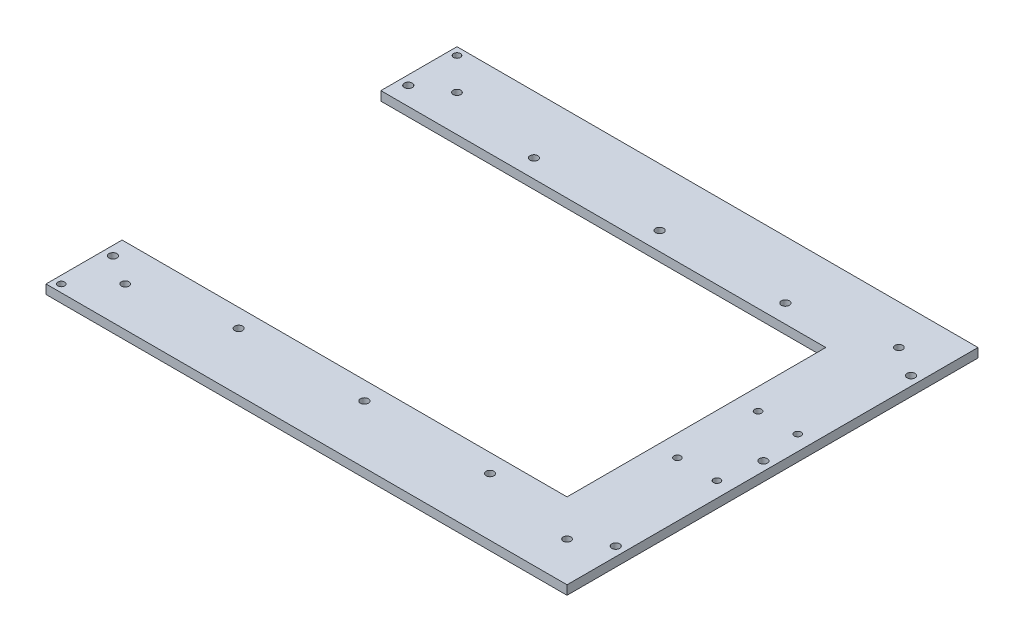
ISO-10303-21;
HEADER;
FILE_DESCRIPTION(('STEP AP214'),'2;1');
FILE_NAME('part.step','',(''),(''),'','','');
FILE_SCHEMA(('AUTOMOTIVE_DESIGN { 1 0 10303 214 1 1 1 1 }'));
ENDSEC;
DATA;
#1=APPLICATION_CONTEXT('core data for automotive mechanical design processes');
#2=APPLICATION_PROTOCOL_DEFINITION('international standard','automotive_design',2000,#1);
#3=PRODUCT_CONTEXT('',#1,'mechanical');
#4=PRODUCT('Part','Part','',(#3));
#5=PRODUCT_RELATED_PRODUCT_CATEGORY('part','',(#4));
#6=PRODUCT_DEFINITION_FORMATION('','',#4);
#7=PRODUCT_DEFINITION_CONTEXT('part definition',#1,'design');
#8=PRODUCT_DEFINITION('design','',#6,#7);
#9=PRODUCT_DEFINITION_SHAPE('','',#8);
#10=(LENGTH_UNIT() NAMED_UNIT(*) SI_UNIT(.MILLI.,.METRE.));
#11=(NAMED_UNIT(*) PLANE_ANGLE_UNIT() SI_UNIT($,.RADIAN.));
#12=(NAMED_UNIT(*) SI_UNIT($,.STERADIAN.) SOLID_ANGLE_UNIT());
#13=UNCERTAINTY_MEASURE_WITH_UNIT(LENGTH_MEASURE(1.E-05),#10,'distance_accuracy_value','');
#14=(GEOMETRIC_REPRESENTATION_CONTEXT(3) GLOBAL_UNCERTAINTY_ASSIGNED_CONTEXT((#13)) GLOBAL_UNIT_ASSIGNED_CONTEXT((#10,
#11,#12)) REPRESENTATION_CONTEXT('',''));
#15=CARTESIAN_POINT('',(0.,0.,0.));
#16=DIRECTION('',(0.,0.,1.));
#17=DIRECTION('',(1.,0.,0.));
#18=AXIS2_PLACEMENT_3D('',#15,#16,#17);
#19=CARTESIAN_POINT('',(0.,0.,0.));
#20=DIRECTION('',(0.,-1.,0.));
#21=DIRECTION('',(0.,0.,-1.));
#22=AXIS2_PLACEMENT_3D('',#19,#20,#21);
#23=PLANE('',#22);
#24=CARTESIAN_POINT('',(-286.3,0.,115.921508101416));
#25=DIRECTION('',(0.,1.,0.));
#26=DIRECTION('',(0.,0.,1.));
#27=AXIS2_PLACEMENT_3D('',#24,#25,#26);
#28=CIRCLE('',#27,2.59999999999999);
#29=CARTESIAN_POINT('',(-286.3,0.,118.521508101416));
#30=VERTEX_POINT('',#29);
#31=EDGE_CURVE('E597',#30,#30,#28,.T.);
#32=ORIENTED_EDGE('',*,*,#31,.T.);
#33=EDGE_LOOP('',(#32));
#34=FACE_BOUND('',#33,.T.);
#35=CARTESIAN_POINT('',(-203.725,0.,115.921508101416));
#36=DIRECTION('',(0.,1.,0.));
#37=DIRECTION('',(0.,0.,1.));
#38=AXIS2_PLACEMENT_3D('',#35,#36,#37);
#39=CIRCLE('',#38,2.59999999999999);
#40=CARTESIAN_POINT('',(-203.725,0.,118.521508101416));
#41=VERTEX_POINT('',#40);
#42=EDGE_CURVE('E607',#41,#41,#39,.T.);
#43=ORIENTED_EDGE('',*,*,#42,.T.);
#44=EDGE_LOOP('',(#43));
#45=FACE_BOUND('',#44,.T.);
#46=CARTESIAN_POINT('',(-121.15,0.,115.921508101416));
#47=DIRECTION('',(0.,1.,0.));
#48=DIRECTION('',(0.,0.,1.));
#49=AXIS2_PLACEMENT_3D('',#46,#47,#48);
#50=CIRCLE('',#49,2.6);
#51=CARTESIAN_POINT('',(-121.15,0.,118.521508101416));
#52=VERTEX_POINT('',#51);
#53=EDGE_CURVE('E613',#52,#52,#50,.T.);
#54=ORIENTED_EDGE('',*,*,#53,.T.);
#55=EDGE_LOOP('',(#54));
#56=FACE_BOUND('',#55,.T.);
#57=CARTESIAN_POINT('',(-38.575,0.,115.921508101416));
#58=DIRECTION('',(0.,1.,0.));
#59=DIRECTION('',(0.,0.,1.));
#60=AXIS2_PLACEMENT_3D('',#57,#58,#59);
#61=CIRCLE('',#60,2.6);
#62=CARTESIAN_POINT('',(-38.575,0.,118.521508101416));
#63=VERTEX_POINT('',#62);
#64=EDGE_CURVE('E619',#63,#63,#61,.T.);
#65=ORIENTED_EDGE('',*,*,#64,.T.);
#66=EDGE_LOOP('',(#65));
#67=FACE_BOUND('',#66,.T.);
#68=CARTESIAN_POINT('',(44.0000000000001,0.,115.921508101416));
#69=DIRECTION('',(0.,1.,0.));
#70=DIRECTION('',(0.,0.,1.));
#71=AXIS2_PLACEMENT_3D('',#68,#69,#70);
#72=CIRCLE('',#71,2.6);
#73=CARTESIAN_POINT('',(44.0000000000001,0.,118.521508101416));
#74=VERTEX_POINT('',#73);
#75=EDGE_CURVE('E625',#74,#74,#72,.T.);
#76=ORIENTED_EDGE('',*,*,#75,.T.);
#77=EDGE_LOOP('',(#76));
#78=FACE_BOUND('',#77,.T.);
#79=CARTESIAN_POINT('',(43.9999999999999,0.,309.921508101416));
#80=DIRECTION('',(0.,1.,0.));
#81=DIRECTION('',(0.,0.,1.));
#82=AXIS2_PLACEMENT_3D('',#79,#80,#81);
#83=CIRCLE('',#82,2.6);
#84=CARTESIAN_POINT('',(43.9999999999999,0.,312.521508101416));
#85=VERTEX_POINT('',#84);
#86=EDGE_CURVE('E631',#85,#85,#83,.T.);
#87=ORIENTED_EDGE('',*,*,#86,.T.);
#88=EDGE_LOOP('',(#87));
#89=FACE_BOUND('',#88,.T.);
#90=CARTESIAN_POINT('',(-38.5750000000001,0.,309.921508101416));
#91=DIRECTION('',(0.,1.,0.));
#92=DIRECTION('',(0.,0.,1.));
#93=AXIS2_PLACEMENT_3D('',#90,#91,#92);
#94=CIRCLE('',#93,2.6);
#95=CARTESIAN_POINT('',(-38.5750000000001,0.,312.521508101416));
#96=VERTEX_POINT('',#95);
#97=EDGE_CURVE('E637',#96,#96,#94,.T.);
#98=ORIENTED_EDGE('',*,*,#97,.T.);
#99=EDGE_LOOP('',(#98));
#100=FACE_BOUND('',#99,.T.);
#101=CARTESIAN_POINT('',(-121.15,0.,309.921508101416));
#102=DIRECTION('',(0.,1.,0.));
#103=DIRECTION('',(0.,0.,1.));
#104=AXIS2_PLACEMENT_3D('',#101,#102,#103);
#105=CIRCLE('',#104,2.6);
#106=CARTESIAN_POINT('',(-121.15,0.,312.521508101416));
#107=VERTEX_POINT('',#106);
#108=EDGE_CURVE('E643',#107,#107,#105,.T.);
#109=ORIENTED_EDGE('',*,*,#108,.T.);
#110=EDGE_LOOP('',(#109));
#111=FACE_BOUND('',#110,.T.);
#112=CARTESIAN_POINT('',(-203.725,0.,309.921508101416));
#113=DIRECTION('',(0.,1.,0.));
#114=DIRECTION('',(0.,0.,1.));
#115=AXIS2_PLACEMENT_3D('',#112,#113,#114);
#116=CIRCLE('',#115,2.59999999999999);
#117=CARTESIAN_POINT('',(-203.725,0.,312.521508101416));
#118=VERTEX_POINT('',#117);
#119=EDGE_CURVE('E649',#118,#118,#116,.T.);
#120=ORIENTED_EDGE('',*,*,#119,.T.);
#121=EDGE_LOOP('',(#120));
#122=FACE_BOUND('',#121,.T.);
#123=CARTESIAN_POINT('',(-286.3,0.,309.921508101416));
#124=DIRECTION('',(0.,1.,0.));
#125=DIRECTION('',(0.,0.,1.));
#126=AXIS2_PLACEMENT_3D('',#123,#124,#125);
#127=CIRCLE('',#126,2.59999999999999);
#128=CARTESIAN_POINT('',(-286.3,0.,312.521508101416));
#129=VERTEX_POINT('',#128);
#130=EDGE_CURVE('E655',#129,#129,#127,.T.);
#131=ORIENTED_EDGE('',*,*,#130,.T.);
#132=EDGE_LOOP('',(#131));
#133=FACE_BOUND('',#132,.T.);
#134=CARTESIAN_POINT('',(43.9999999999999,0.,212.921508101416));
#135=DIRECTION('',(0.,1.,0.));
#136=DIRECTION('',(0.,0.,1.));
#137=AXIS2_PLACEMENT_3D('',#134,#135,#136);
#138=CIRCLE('',#137,2.6);
#139=CARTESIAN_POINT('',(43.9999999999999,0.,215.521508101416));
#140=VERTEX_POINT('',#139);
#141=EDGE_CURVE('E210',#140,#140,#138,.T.);
#142=ORIENTED_EDGE('',*,*,#141,.T.);
#143=EDGE_LOOP('',(#142));
#144=FACE_BOUND('',#143,.T.);
#145=DIRECTION('',(0.,0.,1.));
#146=VECTOR('',#145,1.);
#147=CARTESIAN_POINT('',(-292.3,0.,77.9215081014159));
#148=LINE('',#147,#146);
#149=CARTESIAN_POINT('',(-292.3,0.,77.9215081014159));
#150=VERTEX_POINT('',#149);
#151=CARTESIAN_POINT('',(-292.3,0.,127.921508101416));
#152=VERTEX_POINT('',#151);
#153=EDGE_CURVE('E62',#150,#152,#148,.T.);
#154=ORIENTED_EDGE('',*,*,#153,.F.);
#155=DIRECTION('',(-1.,0.,0.));
#156=VECTOR('',#155,1.);
#157=CARTESIAN_POINT('',(-292.3,0.,77.9215081014159));
#158=LINE('',#157,#156);
#159=CARTESIAN_POINT('',(49.9999999999999,0.,77.9215081014159));
#160=VERTEX_POINT('',#159);
#161=EDGE_CURVE('E162',#160,#150,#158,.T.);
#162=ORIENTED_EDGE('',*,*,#161,.F.);
#163=DIRECTION('',(0.,0.,-1.));
#164=VECTOR('',#163,1.);
#165=CARTESIAN_POINT('',(49.9999999999999,0.,77.9215081014159));
#166=LINE('',#165,#164);
#167=CARTESIAN_POINT('',(49.9999999999999,0.,347.921508101416));
#168=VERTEX_POINT('',#167);
#169=EDGE_CURVE('E236',#168,#160,#166,.T.);
#170=ORIENTED_EDGE('',*,*,#169,.F.);
#171=DIRECTION('',(1.,0.,0.));
#172=VECTOR('',#171,1.);
#173=CARTESIAN_POINT('',(-292.3,0.,347.921508101416));
#174=LINE('',#173,#172);
#175=CARTESIAN_POINT('',(-292.3,0.,347.921508101416));
#176=VERTEX_POINT('',#175);
#177=EDGE_CURVE('E140',#176,#168,#174,.T.);
#178=ORIENTED_EDGE('',*,*,#177,.F.);
#179=DIRECTION('',(0.,0.,1.));
#180=VECTOR('',#179,1.);
#181=CARTESIAN_POINT('',(-292.3,0.,297.921508101416));
#182=LINE('',#181,#180);
#183=CARTESIAN_POINT('',(-292.3,0.,297.921508101416));
#184=VERTEX_POINT('',#183);
#185=EDGE_CURVE('E138',#184,#176,#182,.T.);
#186=ORIENTED_EDGE('',*,*,#185,.F.);
#187=DIRECTION('',(-1.,0.,0.));
#188=VECTOR('',#187,1.);
#189=CARTESIAN_POINT('',(-292.3,0.,297.921508101416));
#190=LINE('',#189,#188);
#191=CARTESIAN_POINT('',(-2.22044604925031E-13,0.,297.921508101416));
#192=VERTEX_POINT('',#191);
#193=EDGE_CURVE('E126',#192,#184,#190,.T.);
#194=ORIENTED_EDGE('',*,*,#193,.F.);
#195=DIRECTION('',(0.,0.,1.));
#196=VECTOR('',#195,1.);
#197=CARTESIAN_POINT('',(-2.22044604925031E-13,0.,127.921508101416));
#198=LINE('',#197,#196);
#199=CARTESIAN_POINT('',(-2.22044604925031E-13,0.,127.921508101416));
#200=VERTEX_POINT('',#199);
#201=EDGE_CURVE('E117',#200,#192,#198,.T.);
#202=ORIENTED_EDGE('',*,*,#201,.F.);
#203=DIRECTION('',(1.,0.,0.));
#204=VECTOR('',#203,1.);
#205=CARTESIAN_POINT('',(-292.3,0.,127.921508101416));
#206=LINE('',#205,#204);
#207=EDGE_CURVE('E125',#152,#200,#206,.T.);
#208=ORIENTED_EDGE('',*,*,#207,.F.);
#209=EDGE_LOOP('',(#154,#162,#170,#178,#186,#194,#202,#208));
#210=FACE_BOUND('',#209,.T.);
#211=CARTESIAN_POINT('',(39.9999999999999,0.,186.421508101416));
#212=DIRECTION('',(0.,-1.,0.));
#213=DIRECTION('',(0.,0.,-1.));
#214=AXIS2_PLACEMENT_3D('',#211,#212,#213);
#215=CIRCLE('',#214,2.25);
#216=CARTESIAN_POINT('',(39.9999999999999,0.,184.171508101416));
#217=VERTEX_POINT('',#216);
#218=EDGE_CURVE('E212',#217,#217,#215,.F.);
#219=ORIENTED_EDGE('',*,*,#218,.T.);
#220=EDGE_LOOP('',(#219));
#221=FACE_BOUND('',#220,.T.);
#222=CARTESIAN_POINT('',(13.9999999999999,0.,239.421508101416));
#223=DIRECTION('',(0.,-1.,0.));
#224=DIRECTION('',(0.,0.,-1.));
#225=AXIS2_PLACEMENT_3D('',#222,#223,#224);
#226=CIRCLE('',#225,2.25);
#227=CARTESIAN_POINT('',(13.9999999999999,0.,237.171508101416));
#228=VERTEX_POINT('',#227);
#229=EDGE_CURVE('E206',#228,#228,#226,.F.);
#230=ORIENTED_EDGE('',*,*,#229,.T.);
#231=EDGE_LOOP('',(#230));
#232=FACE_BOUND('',#231,.T.);
#233=CARTESIAN_POINT('',(13.9999999999999,0.,186.421508101416));
#234=DIRECTION('',(0.,-1.,0.));
#235=DIRECTION('',(0.,0.,-1.));
#236=AXIS2_PLACEMENT_3D('',#233,#234,#235);
#237=CIRCLE('',#236,2.25);
#238=CARTESIAN_POINT('',(13.9999999999999,0.,184.171508101416));
#239=VERTEX_POINT('',#238);
#240=EDGE_CURVE('E209',#239,#239,#237,.F.);
#241=ORIENTED_EDGE('',*,*,#240,.T.);
#242=EDGE_LOOP('',(#241));
#243=FACE_BOUND('',#242,.T.);
#244=CARTESIAN_POINT('',(39.9999999999999,0.,239.421508101416));
#245=DIRECTION('',(0.,-1.,0.));
#246=DIRECTION('',(0.,0.,-1.));
#247=AXIS2_PLACEMENT_3D('',#244,#245,#246);
#248=CIRCLE('',#247,2.25);
#249=CARTESIAN_POINT('',(39.9999999999999,0.,237.171508101416));
#250=VERTEX_POINT('',#249);
#251=EDGE_CURVE('E47',#250,#250,#248,.F.);
#252=ORIENTED_EDGE('',*,*,#251,.T.);
#253=EDGE_LOOP('',(#252));
#254=FACE_BOUND('',#253,.T.);
#255=CARTESIAN_POINT('',(-287.3,0.,342.921508101416));
#256=DIRECTION('',(0.,-1.,0.));
#257=DIRECTION('',(0.,0.,-1.));
#258=AXIS2_PLACEMENT_3D('',#255,#256,#257);
#259=CIRCLE('',#258,2.24999999999996);
#260=CARTESIAN_POINT('',(-287.3,0.,340.671508101416));
#261=VERTEX_POINT('',#260);
#262=EDGE_CURVE('E201',#261,#261,#259,.T.);
#263=ORIENTED_EDGE('',*,*,#262,.F.);
#264=EDGE_LOOP('',(#263));
#265=FACE_BOUND('',#264,.T.);
#266=CARTESIAN_POINT('',(-266.3,0.,321.921508101416));
#267=DIRECTION('',(0.,1.,0.));
#268=DIRECTION('',(0.,0.,1.));
#269=AXIS2_PLACEMENT_3D('',#266,#267,#268);
#270=CIRCLE('',#269,2.49999999999991);
#271=CARTESIAN_POINT('',(-266.3,0.,324.421508101416));
#272=VERTEX_POINT('',#271);
#273=EDGE_CURVE('E168',#272,#272,#270,.T.);
#274=ORIENTED_EDGE('',*,*,#273,.T.);
#275=EDGE_LOOP('',(#274));
#276=FACE_BOUND('',#275,.T.);
#277=CARTESIAN_POINT('',(23.9999999999999,0.,321.921508101416));
#278=DIRECTION('',(0.,1.,0.));
#279=DIRECTION('',(0.,0.,1.));
#280=AXIS2_PLACEMENT_3D('',#277,#278,#279);
#281=CIRCLE('',#280,2.49999999999991);
#282=CARTESIAN_POINT('',(23.9999999999999,0.,324.421508101416));
#283=VERTEX_POINT('',#282);
#284=EDGE_CURVE('E174',#283,#283,#281,.T.);
#285=ORIENTED_EDGE('',*,*,#284,.T.);
#286=EDGE_LOOP('',(#285));
#287=FACE_BOUND('',#286,.T.);
#288=CARTESIAN_POINT('',(-287.3,0.,82.9215081014159));
#289=DIRECTION('',(0.,-1.,0.));
#290=DIRECTION('',(0.,0.,-1.));
#291=AXIS2_PLACEMENT_3D('',#288,#289,#290);
#292=CIRCLE('',#291,2.25000000000001);
#293=CARTESIAN_POINT('',(-287.3,0.,80.6715081014158));
#294=VERTEX_POINT('',#293);
#295=EDGE_CURVE('E53',#294,#294,#292,.T.);
#296=ORIENTED_EDGE('',*,*,#295,.F.);
#297=EDGE_LOOP('',(#296));
#298=FACE_BOUND('',#297,.T.);
#299=CARTESIAN_POINT('',(23.9999999999999,0.,103.921508101416));
#300=DIRECTION('',(0.,1.,0.));
#301=DIRECTION('',(0.,0.,1.));
#302=AXIS2_PLACEMENT_3D('',#299,#300,#301);
#303=CIRCLE('',#302,2.49999999999991);
#304=CARTESIAN_POINT('',(23.9999999999999,0.,106.421508101416));
#305=VERTEX_POINT('',#304);
#306=EDGE_CURVE('E171',#305,#305,#303,.T.);
#307=ORIENTED_EDGE('',*,*,#306,.T.);
#308=EDGE_LOOP('',(#307));
#309=FACE_BOUND('',#308,.T.);
#310=CARTESIAN_POINT('',(-266.3,0.,103.921508101416));
#311=DIRECTION('',(0.,1.,0.));
#312=DIRECTION('',(0.,0.,1.));
#313=AXIS2_PLACEMENT_3D('',#310,#311,#312);
#314=CIRCLE('',#313,2.49999999999991);
#315=CARTESIAN_POINT('',(-266.3,0.,106.421508101416));
#316=VERTEX_POINT('',#315);
#317=EDGE_CURVE('E146',#316,#316,#314,.T.);
#318=ORIENTED_EDGE('',*,*,#317,.T.);
#319=EDGE_LOOP('',(#318));
#320=FACE_BOUND('',#319,.T.);
#321=ADVANCED_FACE('F43',(#34,#45,#56,#67,#78,#89,#100,#111,#122,#133,#144,#210,#221,#232,#243,
#254,#265,#276,#287,#298,#309,#320),#23,.T.);
#322=CARTESIAN_POINT('',(-292.3,6.,127.921508101416));
#323=DIRECTION('',(0.,0.,-1.));
#324=DIRECTION('',(-1.,0.,0.));
#325=AXIS2_PLACEMENT_3D('',#322,#323,#324);
#326=PLANE('',#325);
#327=ORIENTED_EDGE('',*,*,#207,.T.);
#328=DIRECTION('',(0.,-1.,0.));
#329=VECTOR('',#328,1.);
#330=CARTESIAN_POINT('',(-2.22044604925031E-13,6.,127.921508101416));
#331=LINE('',#330,#329);
#332=CARTESIAN_POINT('',(-2.22044604925031E-13,6.,127.921508101416));
#333=VERTEX_POINT('',#332);
#334=EDGE_CURVE('E123',#333,#200,#331,.T.);
#335=ORIENTED_EDGE('',*,*,#334,.F.);
#336=DIRECTION('',(1.,0.,0.));
#337=VECTOR('',#336,1.);
#338=CARTESIAN_POINT('',(-292.3,6.,127.921508101416));
#339=LINE('',#338,#337);
#340=CARTESIAN_POINT('',(-292.3,6.,127.921508101416));
#341=VERTEX_POINT('',#340);
#342=EDGE_CURVE('E91',#341,#333,#339,.T.);
#343=ORIENTED_EDGE('',*,*,#342,.F.);
#344=DIRECTION('',(0.,-1.,0.));
#345=VECTOR('',#344,1.);
#346=CARTESIAN_POINT('',(-292.3,6.,127.921508101416));
#347=LINE('',#346,#345);
#348=EDGE_CURVE('E216',#341,#152,#347,.T.);
#349=ORIENTED_EDGE('',*,*,#348,.T.);
#350=EDGE_LOOP('',(#327,#335,#343,#349));
#351=FACE_BOUND('',#350,.T.);
#352=ADVANCED_FACE('F261',(#351),#326,.F.);
#353=CARTESIAN_POINT('',(-2.22044604925031E-13,6.,127.921508101416));
#354=DIRECTION('',(1.,0.,0.));
#355=DIRECTION('',(0.,0.,-1.));
#356=AXIS2_PLACEMENT_3D('',#353,#354,#355);
#357=PLANE('',#356);
#358=ORIENTED_EDGE('',*,*,#201,.T.);
#359=DIRECTION('',(0.,-1.,0.));
#360=VECTOR('',#359,1.);
#361=CARTESIAN_POINT('',(-2.22044604925031E-13,6.,297.921508101416));
#362=LINE('',#361,#360);
#363=CARTESIAN_POINT('',(-2.22044604925031E-13,6.,297.921508101416));
#364=VERTEX_POINT('',#363);
#365=EDGE_CURVE('E121',#364,#192,#362,.T.);
#366=ORIENTED_EDGE('',*,*,#365,.F.);
#367=DIRECTION('',(0.,0.,1.));
#368=VECTOR('',#367,1.);
#369=CARTESIAN_POINT('',(-2.22044604925031E-13,6.,127.921508101416));
#370=LINE('',#369,#368);
#371=EDGE_CURVE('E157',#333,#364,#370,.T.);
#372=ORIENTED_EDGE('',*,*,#371,.F.);
#373=ORIENTED_EDGE('',*,*,#334,.T.);
#374=EDGE_LOOP('',(#358,#366,#372,#373));
#375=FACE_BOUND('',#374,.T.);
#376=ADVANCED_FACE('F119',(#375),#357,.F.);
#377=CARTESIAN_POINT('',(-292.3,6.,297.921508101416));
#378=DIRECTION('',(0.,0.,1.));
#379=DIRECTION('',(1.,0.,0.));
#380=AXIS2_PLACEMENT_3D('',#377,#378,#379);
#381=PLANE('',#380);
#382=ORIENTED_EDGE('',*,*,#193,.T.);
#383=DIRECTION('',(0.,-1.,0.));
#384=VECTOR('',#383,1.);
#385=CARTESIAN_POINT('',(-292.3,6.,297.921508101416));
#386=LINE('',#385,#384);
#387=CARTESIAN_POINT('',(-292.3,6.,297.921508101416));
#388=VERTEX_POINT('',#387);
#389=EDGE_CURVE('E134',#388,#184,#386,.T.);
#390=ORIENTED_EDGE('',*,*,#389,.F.);
#391=DIRECTION('',(-1.,0.,0.));
#392=VECTOR('',#391,1.);
#393=CARTESIAN_POINT('',(-292.3,6.,297.921508101416));
#394=LINE('',#393,#392);
#395=EDGE_CURVE('E133',#364,#388,#394,.T.);
#396=ORIENTED_EDGE('',*,*,#395,.F.);
#397=ORIENTED_EDGE('',*,*,#365,.T.);
#398=EDGE_LOOP('',(#382,#390,#396,#397));
#399=FACE_BOUND('',#398,.T.);
#400=ADVANCED_FACE('F130',(#399),#381,.F.);
#401=CARTESIAN_POINT('',(-292.3,6.,297.921508101416));
#402=DIRECTION('',(1.,0.,0.));
#403=DIRECTION('',(0.,0.,-1.));
#404=AXIS2_PLACEMENT_3D('',#401,#402,#403);
#405=PLANE('',#404);
#406=ORIENTED_EDGE('',*,*,#389,.T.);
#407=ORIENTED_EDGE('',*,*,#185,.T.);
#408=DIRECTION('',(0.,-1.,0.));
#409=VECTOR('',#408,1.);
#410=CARTESIAN_POINT('',(-292.3,6.,347.921508101416));
#411=LINE('',#410,#409);
#412=CARTESIAN_POINT('',(-292.3,6.,347.921508101416));
#413=VERTEX_POINT('',#412);
#414=EDGE_CURVE('E225',#413,#176,#411,.T.);
#415=ORIENTED_EDGE('',*,*,#414,.F.);
#416=DIRECTION('',(0.,0.,1.));
#417=VECTOR('',#416,1.);
#418=CARTESIAN_POINT('',(-292.3,6.,297.921508101416));
#419=LINE('',#418,#417);
#420=EDGE_CURVE('E154',#388,#413,#419,.T.);
#421=ORIENTED_EDGE('',*,*,#420,.F.);
#422=EDGE_LOOP('',(#406,#407,#415,#421));
#423=FACE_BOUND('',#422,.T.);
#424=ADVANCED_FACE('F251',(#423),#405,.F.);
#425=CARTESIAN_POINT('',(-292.3,6.,347.921508101416));
#426=DIRECTION('',(0.,0.,-1.));
#427=DIRECTION('',(-1.,0.,0.));
#428=AXIS2_PLACEMENT_3D('',#425,#426,#427);
#429=PLANE('',#428);
#430=ORIENTED_EDGE('',*,*,#177,.T.);
#431=DIRECTION('',(0.,-1.,0.));
#432=VECTOR('',#431,1.);
#433=CARTESIAN_POINT('',(49.9999999999999,6.,347.921508101416));
#434=LINE('',#433,#432);
#435=CARTESIAN_POINT('',(49.9999999999999,6.,347.921508101416));
#436=VERTEX_POINT('',#435);
#437=EDGE_CURVE('E228',#436,#168,#434,.T.);
#438=ORIENTED_EDGE('',*,*,#437,.F.);
#439=DIRECTION('',(1.,0.,0.));
#440=VECTOR('',#439,1.);
#441=CARTESIAN_POINT('',(-292.3,6.,347.921508101416));
#442=LINE('',#441,#440);
#443=EDGE_CURVE('E152',#413,#436,#442,.T.);
#444=ORIENTED_EDGE('',*,*,#443,.F.);
#445=ORIENTED_EDGE('',*,*,#414,.T.);
#446=EDGE_LOOP('',(#430,#438,#444,#445));
#447=FACE_BOUND('',#446,.T.);
#448=ADVANCED_FACE('F240',(#447),#429,.F.);
#449=CARTESIAN_POINT('',(49.9999999999999,6.,77.9215081014159));
#450=DIRECTION('',(-1.,0.,0.));
#451=DIRECTION('',(0.,0.,1.));
#452=AXIS2_PLACEMENT_3D('',#449,#450,#451);
#453=PLANE('',#452);
#454=ORIENTED_EDGE('',*,*,#437,.T.);
#455=ORIENTED_EDGE('',*,*,#169,.T.);
#456=DIRECTION('',(0.,-1.,0.));
#457=VECTOR('',#456,1.);
#458=CARTESIAN_POINT('',(49.9999999999999,6.,77.9215081014159));
#459=LINE('',#458,#457);
#460=CARTESIAN_POINT('',(49.9999999999999,6.,77.9215081014159));
#461=VERTEX_POINT('',#460);
#462=EDGE_CURVE('E231',#461,#160,#459,.T.);
#463=ORIENTED_EDGE('',*,*,#462,.F.);
#464=DIRECTION('',(0.,0.,-1.));
#465=VECTOR('',#464,1.);
#466=CARTESIAN_POINT('',(49.9999999999999,6.,77.9215081014159));
#467=LINE('',#466,#465);
#468=EDGE_CURVE('E149',#436,#461,#467,.T.);
#469=ORIENTED_EDGE('',*,*,#468,.F.);
#470=EDGE_LOOP('',(#454,#455,#463,#469));
#471=FACE_BOUND('',#470,.T.);
#472=ADVANCED_FACE('F45',(#471),#453,.F.);
#473=CARTESIAN_POINT('',(0.,6.,0.));
#474=DIRECTION('',(0.,1.,0.));
#475=DIRECTION('',(0.,0.,1.));
#476=AXIS2_PLACEMENT_3D('',#473,#474,#475);
#477=PLANE('',#476);
#478=CARTESIAN_POINT('',(-286.3,6.,115.921508101416));
#479=DIRECTION('',(0.,1.,0.));
#480=DIRECTION('',(0.,0.,1.));
#481=AXIS2_PLACEMENT_3D('',#478,#479,#480);
#482=CIRCLE('',#481,2.59999999999999);
#483=CARTESIAN_POINT('',(-286.3,6.,118.521508101416));
#484=VERTEX_POINT('',#483);
#485=EDGE_CURVE('E600',#484,#484,#482,.T.);
#486=ORIENTED_EDGE('',*,*,#485,.F.);
#487=EDGE_LOOP('',(#486));
#488=FACE_BOUND('',#487,.T.);
#489=CARTESIAN_POINT('',(-203.725,6.,115.921508101416));
#490=DIRECTION('',(0.,1.,0.));
#491=DIRECTION('',(0.,0.,1.));
#492=AXIS2_PLACEMENT_3D('',#489,#490,#491);
#493=CIRCLE('',#492,2.59999999999999);
#494=CARTESIAN_POINT('',(-203.725,6.,118.521508101416));
#495=VERTEX_POINT('',#494);
#496=EDGE_CURVE('E602',#495,#495,#493,.T.);
#497=ORIENTED_EDGE('',*,*,#496,.F.);
#498=EDGE_LOOP('',(#497));
#499=FACE_BOUND('',#498,.T.);
#500=CARTESIAN_POINT('',(-121.15,6.,115.921508101416));
#501=DIRECTION('',(0.,1.,0.));
#502=DIRECTION('',(0.,0.,1.));
#503=AXIS2_PLACEMENT_3D('',#500,#501,#502);
#504=CIRCLE('',#503,2.6);
#505=CARTESIAN_POINT('',(-121.15,6.,118.521508101416));
#506=VERTEX_POINT('',#505);
#507=EDGE_CURVE('E610',#506,#506,#504,.T.);
#508=ORIENTED_EDGE('',*,*,#507,.F.);
#509=EDGE_LOOP('',(#508));
#510=FACE_BOUND('',#509,.T.);
#511=CARTESIAN_POINT('',(-38.575,6.,115.921508101416));
#512=DIRECTION('',(0.,1.,0.));
#513=DIRECTION('',(0.,0.,1.));
#514=AXIS2_PLACEMENT_3D('',#511,#512,#513);
#515=CIRCLE('',#514,2.6);
#516=CARTESIAN_POINT('',(-38.575,6.,118.521508101416));
#517=VERTEX_POINT('',#516);
#518=EDGE_CURVE('E616',#517,#517,#515,.T.);
#519=ORIENTED_EDGE('',*,*,#518,.F.);
#520=EDGE_LOOP('',(#519));
#521=FACE_BOUND('',#520,.T.);
#522=CARTESIAN_POINT('',(44.0000000000001,6.,115.921508101416));
#523=DIRECTION('',(0.,1.,0.));
#524=DIRECTION('',(0.,0.,1.));
#525=AXIS2_PLACEMENT_3D('',#522,#523,#524);
#526=CIRCLE('',#525,2.6);
#527=CARTESIAN_POINT('',(44.0000000000001,6.,118.521508101416));
#528=VERTEX_POINT('',#527);
#529=EDGE_CURVE('E622',#528,#528,#526,.T.);
#530=ORIENTED_EDGE('',*,*,#529,.F.);
#531=EDGE_LOOP('',(#530));
#532=FACE_BOUND('',#531,.T.);
#533=CARTESIAN_POINT('',(43.9999999999999,6.,309.921508101416));
#534=DIRECTION('',(0.,1.,0.));
#535=DIRECTION('',(0.,0.,1.));
#536=AXIS2_PLACEMENT_3D('',#533,#534,#535);
#537=CIRCLE('',#536,2.6);
#538=CARTESIAN_POINT('',(43.9999999999999,6.,312.521508101416));
#539=VERTEX_POINT('',#538);
#540=EDGE_CURVE('E628',#539,#539,#537,.T.);
#541=ORIENTED_EDGE('',*,*,#540,.F.);
#542=EDGE_LOOP('',(#541));
#543=FACE_BOUND('',#542,.T.);
#544=CARTESIAN_POINT('',(-38.5750000000001,6.,309.921508101416));
#545=DIRECTION('',(0.,1.,0.));
#546=DIRECTION('',(0.,0.,1.));
#547=AXIS2_PLACEMENT_3D('',#544,#545,#546);
#548=CIRCLE('',#547,2.6);
#549=CARTESIAN_POINT('',(-38.5750000000001,6.,312.521508101416));
#550=VERTEX_POINT('',#549);
#551=EDGE_CURVE('E634',#550,#550,#548,.T.);
#552=ORIENTED_EDGE('',*,*,#551,.F.);
#553=EDGE_LOOP('',(#552));
#554=FACE_BOUND('',#553,.T.);
#555=CARTESIAN_POINT('',(-121.15,6.,309.921508101416));
#556=DIRECTION('',(0.,1.,0.));
#557=DIRECTION('',(0.,0.,1.));
#558=AXIS2_PLACEMENT_3D('',#555,#556,#557);
#559=CIRCLE('',#558,2.6);
#560=CARTESIAN_POINT('',(-121.15,6.,312.521508101416));
#561=VERTEX_POINT('',#560);
#562=EDGE_CURVE('E640',#561,#561,#559,.T.);
#563=ORIENTED_EDGE('',*,*,#562,.F.);
#564=EDGE_LOOP('',(#563));
#565=FACE_BOUND('',#564,.T.);
#566=CARTESIAN_POINT('',(-203.725,6.,309.921508101416));
#567=DIRECTION('',(0.,1.,0.));
#568=DIRECTION('',(0.,0.,1.));
#569=AXIS2_PLACEMENT_3D('',#566,#567,#568);
#570=CIRCLE('',#569,2.59999999999999);
#571=CARTESIAN_POINT('',(-203.725,6.,312.521508101416));
#572=VERTEX_POINT('',#571);
#573=EDGE_CURVE('E646',#572,#572,#570,.T.);
#574=ORIENTED_EDGE('',*,*,#573,.F.);
#575=EDGE_LOOP('',(#574));
#576=FACE_BOUND('',#575,.T.);
#577=CARTESIAN_POINT('',(-286.3,6.,309.921508101416));
#578=DIRECTION('',(0.,1.,0.));
#579=DIRECTION('',(0.,0.,1.));
#580=AXIS2_PLACEMENT_3D('',#577,#578,#579);
#581=CIRCLE('',#580,2.59999999999999);
#582=CARTESIAN_POINT('',(-286.3,6.,312.521508101416));
#583=VERTEX_POINT('',#582);
#584=EDGE_CURVE('E652',#583,#583,#581,.T.);
#585=ORIENTED_EDGE('',*,*,#584,.F.);
#586=EDGE_LOOP('',(#585));
#587=FACE_BOUND('',#586,.T.);
#588=CARTESIAN_POINT('',(43.9999999999999,6.,212.921508101416));
#589=DIRECTION('',(0.,1.,0.));
#590=DIRECTION('',(0.,0.,1.));
#591=AXIS2_PLACEMENT_3D('',#588,#589,#590);
#592=CIRCLE('',#591,2.6);
#593=CARTESIAN_POINT('',(43.9999999999999,6.,215.521508101416));
#594=VERTEX_POINT('',#593);
#595=EDGE_CURVE('E657',#594,#594,#592,.T.);
#596=ORIENTED_EDGE('',*,*,#595,.F.);
#597=EDGE_LOOP('',(#596));
#598=FACE_BOUND('',#597,.T.);
#599=CARTESIAN_POINT('',(-287.3,6.,342.921508101416));
#600=DIRECTION('',(0.,-1.,0.));
#601=DIRECTION('',(0.,0.,-1.));
#602=AXIS2_PLACEMENT_3D('',#599,#600,#601);
#603=CIRCLE('',#602,2.24999999999996);
#604=CARTESIAN_POINT('',(-287.3,6.,340.671508101416));
#605=VERTEX_POINT('',#604);
#606=EDGE_CURVE('E193',#605,#605,#603,.T.);
#607=ORIENTED_EDGE('',*,*,#606,.T.);
#608=EDGE_LOOP('',(#607));
#609=FACE_BOUND('',#608,.T.);
#610=CARTESIAN_POINT('',(-287.3,6.,82.9215081014159));
#611=DIRECTION('',(0.,-1.,0.));
#612=DIRECTION('',(0.,0.,-1.));
#613=AXIS2_PLACEMENT_3D('',#610,#611,#612);
#614=CIRCLE('',#613,2.25000000000001);
#615=CARTESIAN_POINT('',(-287.3,6.,80.6715081014158));
#616=VERTEX_POINT('',#615);
#617=EDGE_CURVE('E11',#616,#616,#614,.T.);
#618=ORIENTED_EDGE('',*,*,#617,.T.);
#619=EDGE_LOOP('',(#618));
#620=FACE_BOUND('',#619,.T.);
#621=CARTESIAN_POINT('',(13.9999999999999,6.,239.421508101416));
#622=DIRECTION('',(0.,-1.,0.));
#623=DIRECTION('',(0.,0.,-1.));
#624=AXIS2_PLACEMENT_3D('',#621,#622,#623);
#625=CIRCLE('',#624,2.25);
#626=CARTESIAN_POINT('',(13.9999999999999,6.,237.171508101416));
#627=VERTEX_POINT('',#626);
#628=EDGE_CURVE('E190',#627,#627,#625,.T.);
#629=ORIENTED_EDGE('',*,*,#628,.T.);
#630=EDGE_LOOP('',(#629));
#631=FACE_BOUND('',#630,.T.);
#632=CARTESIAN_POINT('',(13.9999999999999,6.,186.421508101416));
#633=DIRECTION('',(0.,-1.,0.));
#634=DIRECTION('',(0.,0.,-1.));
#635=AXIS2_PLACEMENT_3D('',#632,#633,#634);
#636=CIRCLE('',#635,2.25);
#637=CARTESIAN_POINT('',(13.9999999999999,6.,184.171508101416));
#638=VERTEX_POINT('',#637);
#639=EDGE_CURVE('E194',#638,#638,#636,.T.);
#640=ORIENTED_EDGE('',*,*,#639,.T.);
#641=EDGE_LOOP('',(#640));
#642=FACE_BOUND('',#641,.T.);
#643=CARTESIAN_POINT('',(39.9999999999999,6.,186.421508101416));
#644=DIRECTION('',(0.,-1.,0.));
#645=DIRECTION('',(0.,0.,-1.));
#646=AXIS2_PLACEMENT_3D('',#643,#644,#645);
#647=CIRCLE('',#646,2.25);
#648=CARTESIAN_POINT('',(39.9999999999999,6.,184.171508101416));
#649=VERTEX_POINT('',#648);
#650=EDGE_CURVE('E189',#649,#649,#647,.T.);
#651=ORIENTED_EDGE('',*,*,#650,.T.);
#652=EDGE_LOOP('',(#651));
#653=FACE_BOUND('',#652,.T.);
#654=CARTESIAN_POINT('',(39.9999999999999,6.,239.421508101416));
#655=DIRECTION('',(0.,-1.,0.));
#656=DIRECTION('',(0.,0.,-1.));
#657=AXIS2_PLACEMENT_3D('',#654,#655,#656);
#658=CIRCLE('',#657,2.25);
#659=CARTESIAN_POINT('',(39.9999999999999,6.,237.171508101416));
#660=VERTEX_POINT('',#659);
#661=EDGE_CURVE('E181',#660,#660,#658,.T.);
#662=ORIENTED_EDGE('',*,*,#661,.T.);
#663=EDGE_LOOP('',(#662));
#664=FACE_BOUND('',#663,.T.);
#665=CARTESIAN_POINT('',(-266.3,6.,321.921508101416));
#666=DIRECTION('',(0.,1.,0.));
#667=DIRECTION('',(0.,0.,1.));
#668=AXIS2_PLACEMENT_3D('',#665,#666,#667);
#669=CIRCLE('',#668,2.49999999999991);
#670=CARTESIAN_POINT('',(-266.3,6.,324.421508101416));
#671=VERTEX_POINT('',#670);
#672=EDGE_CURVE('E177',#671,#671,#669,.T.);
#673=ORIENTED_EDGE('',*,*,#672,.F.);
#674=EDGE_LOOP('',(#673));
#675=FACE_BOUND('',#674,.T.);
#676=CARTESIAN_POINT('',(23.9999999999999,6.,103.921508101416));
#677=DIRECTION('',(0.,1.,0.));
#678=DIRECTION('',(0.,0.,1.));
#679=AXIS2_PLACEMENT_3D('',#676,#677,#678);
#680=CIRCLE('',#679,2.49999999999991);
#681=CARTESIAN_POINT('',(23.9999999999999,6.,106.421508101416));
#682=VERTEX_POINT('',#681);
#683=EDGE_CURVE('E182',#682,#682,#680,.T.);
#684=ORIENTED_EDGE('',*,*,#683,.F.);
#685=EDGE_LOOP('',(#684));
#686=FACE_BOUND('',#685,.T.);
#687=CARTESIAN_POINT('',(23.9999999999999,6.,321.921508101416));
#688=DIRECTION('',(0.,1.,0.));
#689=DIRECTION('',(0.,0.,1.));
#690=AXIS2_PLACEMENT_3D('',#687,#688,#689);
#691=CIRCLE('',#690,2.49999999999991);
#692=CARTESIAN_POINT('',(23.9999999999999,6.,324.421508101416));
#693=VERTEX_POINT('',#692);
#694=EDGE_CURVE('E178',#693,#693,#691,.T.);
#695=ORIENTED_EDGE('',*,*,#694,.F.);
#696=EDGE_LOOP('',(#695));
#697=FACE_BOUND('',#696,.T.);
#698=CARTESIAN_POINT('',(-266.3,6.,103.921508101416));
#699=DIRECTION('',(0.,1.,0.));
#700=DIRECTION('',(0.,0.,1.));
#701=AXIS2_PLACEMENT_3D('',#698,#699,#700);
#702=CIRCLE('',#701,2.49999999999991);
#703=CARTESIAN_POINT('',(-266.3,6.,106.421508101416));
#704=VERTEX_POINT('',#703);
#705=EDGE_CURVE('E165',#704,#704,#702,.T.);
#706=ORIENTED_EDGE('',*,*,#705,.F.);
#707=EDGE_LOOP('',(#706));
#708=FACE_BOUND('',#707,.T.);
#709=DIRECTION('',(0.,0.,1.));
#710=VECTOR('',#709,1.);
#711=CARTESIAN_POINT('',(-292.3,6.,77.9215081014159));
#712=LINE('',#711,#710);
#713=CARTESIAN_POINT('',(-292.3,6.,77.9215081014159));
#714=VERTEX_POINT('',#713);
#715=EDGE_CURVE('E160',#714,#341,#712,.T.);
#716=ORIENTED_EDGE('',*,*,#715,.T.);
#717=ORIENTED_EDGE('',*,*,#342,.T.);
#718=ORIENTED_EDGE('',*,*,#371,.T.);
#719=ORIENTED_EDGE('',*,*,#395,.T.);
#720=ORIENTED_EDGE('',*,*,#420,.T.);
#721=ORIENTED_EDGE('',*,*,#443,.T.);
#722=ORIENTED_EDGE('',*,*,#468,.T.);
#723=DIRECTION('',(-1.,0.,0.));
#724=VECTOR('',#723,1.);
#725=CARTESIAN_POINT('',(-292.3,6.,77.9215081014159));
#726=LINE('',#725,#724);
#727=EDGE_CURVE('E147',#461,#714,#726,.T.);
#728=ORIENTED_EDGE('',*,*,#727,.T.);
#729=EDGE_LOOP('',(#716,#717,#718,#719,#720,#721,#722,#728));
#730=FACE_BOUND('',#729,.T.);
#731=ADVANCED_FACE('F247',(#488,#499,#510,#521,#532,#543,#554,#565,#576,#587,#598,#609,#620,
#631,#642,#653,#664,#675,#686,#697,#708,#730),#477,.T.);
#732=CARTESIAN_POINT('',(-287.3,6.,342.921508101416));
#733=DIRECTION('',(0.,-1.,0.));
#734=DIRECTION('',(0.,0.,-1.));
#735=AXIS2_PLACEMENT_3D('',#732,#733,#734);
#736=CYLINDRICAL_SURFACE('',#735,2.24999999999996);
#737=ORIENTED_EDGE('',*,*,#606,.F.);
#738=EDGE_LOOP('',(#737));
#739=FACE_BOUND('',#738,.T.);
#740=ORIENTED_EDGE('',*,*,#262,.T.);
#741=EDGE_LOOP('',(#740));
#742=FACE_BOUND('',#741,.T.);
#743=ADVANCED_FACE('F282',(#739,#742),#736,.F.);
#744=CARTESIAN_POINT('',(-287.3,6.,82.9215081014159));
#745=DIRECTION('',(0.,-1.,0.));
#746=DIRECTION('',(0.,0.,-1.));
#747=AXIS2_PLACEMENT_3D('',#744,#745,#746);
#748=CYLINDRICAL_SURFACE('',#747,2.25000000000001);
#749=ORIENTED_EDGE('',*,*,#617,.F.);
#750=EDGE_LOOP('',(#749));
#751=FACE_BOUND('',#750,.T.);
#752=ORIENTED_EDGE('',*,*,#295,.T.);
#753=EDGE_LOOP('',(#752));
#754=FACE_BOUND('',#753,.T.);
#755=ADVANCED_FACE('F301',(#751,#754),#748,.F.);
#756=CARTESIAN_POINT('',(13.9999999999999,6.,239.421508101416));
#757=DIRECTION('',(0.,-1.,0.));
#758=DIRECTION('',(0.,0.,-1.));
#759=AXIS2_PLACEMENT_3D('',#756,#757,#758);
#760=CYLINDRICAL_SURFACE('',#759,2.25);
#761=ORIENTED_EDGE('',*,*,#628,.F.);
#762=EDGE_LOOP('',(#761));
#763=FACE_BOUND('',#762,.T.);
#764=ORIENTED_EDGE('',*,*,#229,.F.);
#765=EDGE_LOOP('',(#764));
#766=FACE_BOUND('',#765,.T.);
#767=ADVANCED_FACE('F304',(#763,#766),#760,.F.);
#768=CARTESIAN_POINT('',(13.9999999999999,6.,186.421508101416));
#769=DIRECTION('',(0.,-1.,0.));
#770=DIRECTION('',(0.,0.,-1.));
#771=AXIS2_PLACEMENT_3D('',#768,#769,#770);
#772=CYLINDRICAL_SURFACE('',#771,2.25);
#773=ORIENTED_EDGE('',*,*,#639,.F.);
#774=EDGE_LOOP('',(#773));
#775=FACE_BOUND('',#774,.T.);
#776=ORIENTED_EDGE('',*,*,#240,.F.);
#777=EDGE_LOOP('',(#776));
#778=FACE_BOUND('',#777,.T.);
#779=ADVANCED_FACE('F311',(#775,#778),#772,.F.);
#780=CARTESIAN_POINT('',(39.9999999999999,6.,186.421508101416));
#781=DIRECTION('',(0.,-1.,0.));
#782=DIRECTION('',(0.,0.,-1.));
#783=AXIS2_PLACEMENT_3D('',#780,#781,#782);
#784=CYLINDRICAL_SURFACE('',#783,2.25);
#785=ORIENTED_EDGE('',*,*,#650,.F.);
#786=EDGE_LOOP('',(#785));
#787=FACE_BOUND('',#786,.T.);
#788=ORIENTED_EDGE('',*,*,#218,.F.);
#789=EDGE_LOOP('',(#788));
#790=FACE_BOUND('',#789,.T.);
#791=ADVANCED_FACE('F315',(#787,#790),#784,.F.);
#792=CARTESIAN_POINT('',(39.9999999999999,6.,239.421508101416));
#793=DIRECTION('',(0.,-1.,0.));
#794=DIRECTION('',(0.,0.,-1.));
#795=AXIS2_PLACEMENT_3D('',#792,#793,#794);
#796=CYLINDRICAL_SURFACE('',#795,2.25);
#797=ORIENTED_EDGE('',*,*,#661,.F.);
#798=EDGE_LOOP('',(#797));
#799=FACE_BOUND('',#798,.T.);
#800=ORIENTED_EDGE('',*,*,#251,.F.);
#801=EDGE_LOOP('',(#800));
#802=FACE_BOUND('',#801,.T.);
#803=ADVANCED_FACE('F299',(#799,#802),#796,.F.);
#804=CARTESIAN_POINT('',(-266.3,-6.,321.921508101416));
#805=DIRECTION('',(0.,1.,0.));
#806=DIRECTION('',(0.,0.,1.));
#807=AXIS2_PLACEMENT_3D('',#804,#805,#806);
#808=CYLINDRICAL_SURFACE('',#807,2.49999999999991);
#809=ORIENTED_EDGE('',*,*,#672,.T.);
#810=EDGE_LOOP('',(#809));
#811=FACE_BOUND('',#810,.T.);
#812=ORIENTED_EDGE('',*,*,#273,.F.);
#813=EDGE_LOOP('',(#812));
#814=FACE_BOUND('',#813,.T.);
#815=ADVANCED_FACE('F295',(#811,#814),#808,.F.);
#816=CARTESIAN_POINT('',(23.9999999999999,-6.,103.921508101416));
#817=DIRECTION('',(0.,1.,0.));
#818=DIRECTION('',(0.,0.,1.));
#819=AXIS2_PLACEMENT_3D('',#816,#817,#818);
#820=CYLINDRICAL_SURFACE('',#819,2.49999999999991);
#821=ORIENTED_EDGE('',*,*,#683,.T.);
#822=EDGE_LOOP('',(#821));
#823=FACE_BOUND('',#822,.T.);
#824=ORIENTED_EDGE('',*,*,#306,.F.);
#825=EDGE_LOOP('',(#824));
#826=FACE_BOUND('',#825,.T.);
#827=ADVANCED_FACE('F291',(#823,#826),#820,.F.);
#828=CARTESIAN_POINT('',(23.9999999999999,-6.,321.921508101416));
#829=DIRECTION('',(0.,1.,0.));
#830=DIRECTION('',(0.,0.,1.));
#831=AXIS2_PLACEMENT_3D('',#828,#829,#830);
#832=CYLINDRICAL_SURFACE('',#831,2.49999999999991);
#833=ORIENTED_EDGE('',*,*,#694,.T.);
#834=EDGE_LOOP('',(#833));
#835=FACE_BOUND('',#834,.T.);
#836=ORIENTED_EDGE('',*,*,#284,.F.);
#837=EDGE_LOOP('',(#836));
#838=FACE_BOUND('',#837,.T.);
#839=ADVANCED_FACE('F287',(#835,#838),#832,.F.);
#840=CARTESIAN_POINT('',(-266.3,-6.,103.921508101416));
#841=DIRECTION('',(0.,1.,0.));
#842=DIRECTION('',(0.,0.,1.));
#843=AXIS2_PLACEMENT_3D('',#840,#841,#842);
#844=CYLINDRICAL_SURFACE('',#843,2.49999999999991);
#845=ORIENTED_EDGE('',*,*,#705,.T.);
#846=EDGE_LOOP('',(#845));
#847=FACE_BOUND('',#846,.T.);
#848=ORIENTED_EDGE('',*,*,#317,.F.);
#849=EDGE_LOOP('',(#848));
#850=FACE_BOUND('',#849,.T.);
#851=ADVANCED_FACE('F284',(#847,#850),#844,.F.);
#852=CARTESIAN_POINT('',(-292.3,6.,77.9215081014159));
#853=DIRECTION('',(1.,0.,0.));
#854=DIRECTION('',(0.,0.,-1.));
#855=AXIS2_PLACEMENT_3D('',#852,#853,#854);
#856=PLANE('',#855);
#857=DIRECTION('',(0.,-1.,0.));
#858=VECTOR('',#857,1.);
#859=CARTESIAN_POINT('',(-292.3,6.,77.9215081014159));
#860=LINE('',#859,#858);
#861=EDGE_CURVE('E150',#714,#150,#860,.T.);
#862=ORIENTED_EDGE('',*,*,#861,.T.);
#863=ORIENTED_EDGE('',*,*,#153,.T.);
#864=ORIENTED_EDGE('',*,*,#348,.F.);
#865=ORIENTED_EDGE('',*,*,#715,.F.);
#866=EDGE_LOOP('',(#862,#863,#864,#865));
#867=FACE_BOUND('',#866,.T.);
#868=ADVANCED_FACE('F278',(#867),#856,.F.);
#869=CARTESIAN_POINT('',(-292.3,6.,77.9215081014159));
#870=DIRECTION('',(0.,0.,1.));
#871=DIRECTION('',(1.,0.,0.));
#872=AXIS2_PLACEMENT_3D('',#869,#870,#871);
#873=PLANE('',#872);
#874=ORIENTED_EDGE('',*,*,#161,.T.);
#875=ORIENTED_EDGE('',*,*,#861,.F.);
#876=ORIENTED_EDGE('',*,*,#727,.F.);
#877=ORIENTED_EDGE('',*,*,#462,.T.);
#878=EDGE_LOOP('',(#874,#875,#876,#877));
#879=FACE_BOUND('',#878,.T.);
#880=ADVANCED_FACE('F272',(#879),#873,.F.);
#881=CARTESIAN_POINT('',(43.9999999999999,6.,212.921508101416));
#882=DIRECTION('',(0.,1.,0.));
#883=DIRECTION('',(0.,0.,1.));
#884=AXIS2_PLACEMENT_3D('',#881,#882,#883);
#885=CYLINDRICAL_SURFACE('',#884,2.6);
#886=ORIENTED_EDGE('',*,*,#141,.F.);
#887=EDGE_LOOP('',(#886));
#888=FACE_BOUND('',#887,.T.);
#889=ORIENTED_EDGE('',*,*,#595,.T.);
#890=EDGE_LOOP('',(#889));
#891=FACE_BOUND('',#890,.T.);
#892=ADVANCED_FACE('F271',(#888,#891),#885,.F.);
#893=CARTESIAN_POINT('',(-286.3,6.,309.921508101416));
#894=DIRECTION('',(0.,1.,0.));
#895=DIRECTION('',(0.,0.,1.));
#896=AXIS2_PLACEMENT_3D('',#893,#894,#895);
#897=CYLINDRICAL_SURFACE('',#896,2.59999999999999);
#898=ORIENTED_EDGE('',*,*,#130,.F.);
#899=EDGE_LOOP('',(#898));
#900=FACE_BOUND('',#899,.T.);
#901=ORIENTED_EDGE('',*,*,#584,.T.);
#902=EDGE_LOOP('',(#901));
#903=FACE_BOUND('',#902,.T.);
#904=ADVANCED_FACE('F402',(#900,#903),#897,.F.);
#905=CARTESIAN_POINT('',(-203.725,6.,309.921508101416));
#906=DIRECTION('',(0.,1.,0.));
#907=DIRECTION('',(0.,0.,1.));
#908=AXIS2_PLACEMENT_3D('',#905,#906,#907);
#909=CYLINDRICAL_SURFACE('',#908,2.59999999999999);
#910=ORIENTED_EDGE('',*,*,#119,.F.);
#911=EDGE_LOOP('',(#910));
#912=FACE_BOUND('',#911,.T.);
#913=ORIENTED_EDGE('',*,*,#573,.T.);
#914=EDGE_LOOP('',(#913));
#915=FACE_BOUND('',#914,.T.);
#916=ADVANCED_FACE('F410',(#912,#915),#909,.F.);
#917=CARTESIAN_POINT('',(-121.15,6.,309.921508101416));
#918=DIRECTION('',(0.,1.,0.));
#919=DIRECTION('',(0.,0.,1.));
#920=AXIS2_PLACEMENT_3D('',#917,#918,#919);
#921=CYLINDRICAL_SURFACE('',#920,2.6);
#922=ORIENTED_EDGE('',*,*,#108,.F.);
#923=EDGE_LOOP('',(#922));
#924=FACE_BOUND('',#923,.T.);
#925=ORIENTED_EDGE('',*,*,#562,.T.);
#926=EDGE_LOOP('',(#925));
#927=FACE_BOUND('',#926,.T.);
#928=ADVANCED_FACE('F418',(#924,#927),#921,.F.);
#929=CARTESIAN_POINT('',(-38.5750000000001,6.,309.921508101416));
#930=DIRECTION('',(0.,1.,0.));
#931=DIRECTION('',(0.,0.,1.));
#932=AXIS2_PLACEMENT_3D('',#929,#930,#931);
#933=CYLINDRICAL_SURFACE('',#932,2.6);
#934=ORIENTED_EDGE('',*,*,#97,.F.);
#935=EDGE_LOOP('',(#934));
#936=FACE_BOUND('',#935,.T.);
#937=ORIENTED_EDGE('',*,*,#551,.T.);
#938=EDGE_LOOP('',(#937));
#939=FACE_BOUND('',#938,.T.);
#940=ADVANCED_FACE('F427',(#936,#939),#933,.F.);
#941=CARTESIAN_POINT('',(43.9999999999999,6.,309.921508101416));
#942=DIRECTION('',(0.,1.,0.));
#943=DIRECTION('',(0.,0.,1.));
#944=AXIS2_PLACEMENT_3D('',#941,#942,#943);
#945=CYLINDRICAL_SURFACE('',#944,2.6);
#946=ORIENTED_EDGE('',*,*,#86,.F.);
#947=EDGE_LOOP('',(#946));
#948=FACE_BOUND('',#947,.T.);
#949=ORIENTED_EDGE('',*,*,#540,.T.);
#950=EDGE_LOOP('',(#949));
#951=FACE_BOUND('',#950,.T.);
#952=ADVANCED_FACE('F436',(#948,#951),#945,.F.);
#953=CARTESIAN_POINT('',(44.0000000000001,6.,115.921508101416));
#954=DIRECTION('',(0.,1.,0.));
#955=DIRECTION('',(0.,0.,1.));
#956=AXIS2_PLACEMENT_3D('',#953,#954,#955);
#957=CYLINDRICAL_SURFACE('',#956,2.6);
#958=ORIENTED_EDGE('',*,*,#75,.F.);
#959=EDGE_LOOP('',(#958));
#960=FACE_BOUND('',#959,.T.);
#961=ORIENTED_EDGE('',*,*,#529,.T.);
#962=EDGE_LOOP('',(#961));
#963=FACE_BOUND('',#962,.T.);
#964=ADVANCED_FACE('F445',(#960,#963),#957,.F.);
#965=CARTESIAN_POINT('',(-38.575,6.,115.921508101416));
#966=DIRECTION('',(0.,1.,0.));
#967=DIRECTION('',(0.,0.,1.));
#968=AXIS2_PLACEMENT_3D('',#965,#966,#967);
#969=CYLINDRICAL_SURFACE('',#968,2.6);
#970=ORIENTED_EDGE('',*,*,#64,.F.);
#971=EDGE_LOOP('',(#970));
#972=FACE_BOUND('',#971,.T.);
#973=ORIENTED_EDGE('',*,*,#518,.T.);
#974=EDGE_LOOP('',(#973));
#975=FACE_BOUND('',#974,.T.);
#976=ADVANCED_FACE('F454',(#972,#975),#969,.F.);
#977=CARTESIAN_POINT('',(-121.15,6.,115.921508101416));
#978=DIRECTION('',(0.,1.,0.));
#979=DIRECTION('',(0.,0.,1.));
#980=AXIS2_PLACEMENT_3D('',#977,#978,#979);
#981=CYLINDRICAL_SURFACE('',#980,2.6);
#982=ORIENTED_EDGE('',*,*,#53,.F.);
#983=EDGE_LOOP('',(#982));
#984=FACE_BOUND('',#983,.T.);
#985=ORIENTED_EDGE('',*,*,#507,.T.);
#986=EDGE_LOOP('',(#985));
#987=FACE_BOUND('',#986,.T.);
#988=ADVANCED_FACE('F463',(#984,#987),#981,.F.);
#989=CARTESIAN_POINT('',(-203.725,6.,115.921508101416));
#990=DIRECTION('',(0.,1.,0.));
#991=DIRECTION('',(0.,0.,1.));
#992=AXIS2_PLACEMENT_3D('',#989,#990,#991);
#993=CYLINDRICAL_SURFACE('',#992,2.59999999999999);
#994=ORIENTED_EDGE('',*,*,#42,.F.);
#995=EDGE_LOOP('',(#994));
#996=FACE_BOUND('',#995,.T.);
#997=ORIENTED_EDGE('',*,*,#496,.T.);
#998=EDGE_LOOP('',(#997));
#999=FACE_BOUND('',#998,.T.);
#1000=ADVANCED_FACE('F472',(#996,#999),#993,.F.);
#1001=CARTESIAN_POINT('',(-286.3,6.,115.921508101416));
#1002=DIRECTION('',(0.,1.,0.));
#1003=DIRECTION('',(0.,0.,1.));
#1004=AXIS2_PLACEMENT_3D('',#1001,#1002,#1003);
#1005=CYLINDRICAL_SURFACE('',#1004,2.59999999999999);
#1006=ORIENTED_EDGE('',*,*,#31,.F.);
#1007=EDGE_LOOP('',(#1006));
#1008=FACE_BOUND('',#1007,.T.);
#1009=ORIENTED_EDGE('',*,*,#485,.T.);
#1010=EDGE_LOOP('',(#1009));
#1011=FACE_BOUND('',#1010,.T.);
#1012=ADVANCED_FACE('F481',(#1008,#1011),#1005,.F.);
#1013=CLOSED_SHELL('',(#321,#352,#376,#400,#424,#448,#472,#731,#743,#755,#767,#779,#791,#803,
#815,#827,#839,#851,#868,#880,#892,#904,#916,#928,#940,#952,#964,#976,#988,#1000,#1012));
#1014=MANIFOLD_SOLID_BREP('B2',#1013);
#1015=ADVANCED_BREP_SHAPE_REPRESENTATION('',(#18,#1014),#14);
#1016=SHAPE_DEFINITION_REPRESENTATION(#9,#1015);
ENDSEC;
END-ISO-10303-21;
